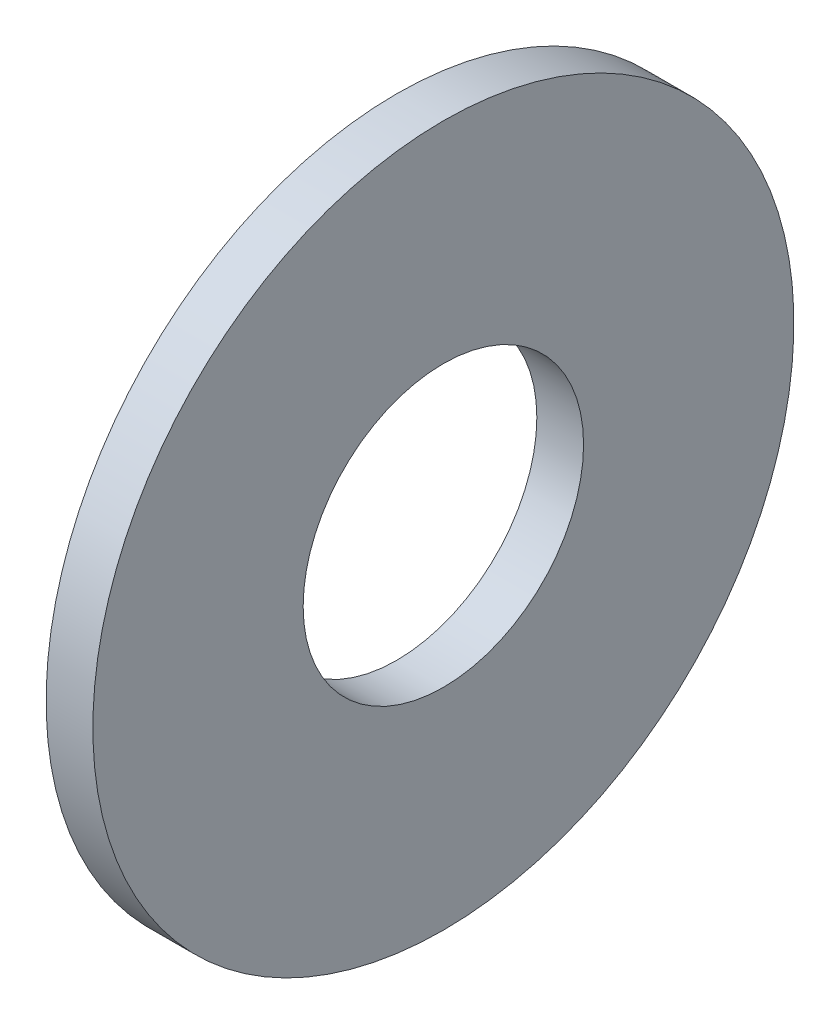
ISO-10303-21;
HEADER;
FILE_DESCRIPTION(('STEP AP214'),'2;1');
FILE_NAME('part.step','',(''),(''),'','','');
FILE_SCHEMA(('AUTOMOTIVE_DESIGN { 1 0 10303 214 1 1 1 1 }'));
ENDSEC;
DATA;
#1=APPLICATION_CONTEXT('core data for automotive mechanical design processes');
#2=APPLICATION_PROTOCOL_DEFINITION('international standard','automotive_design',2000,#1);
#3=PRODUCT_CONTEXT('',#1,'mechanical');
#4=PRODUCT('Part','Part','',(#3));
#5=PRODUCT_RELATED_PRODUCT_CATEGORY('part','',(#4));
#6=PRODUCT_DEFINITION_FORMATION('','',#4);
#7=PRODUCT_DEFINITION_CONTEXT('part definition',#1,'design');
#8=PRODUCT_DEFINITION('design','',#6,#7);
#9=PRODUCT_DEFINITION_SHAPE('','',#8);
#10=(LENGTH_UNIT() NAMED_UNIT(*) SI_UNIT(.MILLI.,.METRE.));
#11=(NAMED_UNIT(*) PLANE_ANGLE_UNIT() SI_UNIT($,.RADIAN.));
#12=(NAMED_UNIT(*) SI_UNIT($,.STERADIAN.) SOLID_ANGLE_UNIT());
#13=UNCERTAINTY_MEASURE_WITH_UNIT(LENGTH_MEASURE(1.E-05),#10,'distance_accuracy_value','');
#14=(GEOMETRIC_REPRESENTATION_CONTEXT(3) GLOBAL_UNCERTAINTY_ASSIGNED_CONTEXT((#13)) GLOBAL_UNIT_ASSIGNED_CONTEXT((#10,
#11,#12)) REPRESENTATION_CONTEXT('',''));
#15=CARTESIAN_POINT('',(0.,0.,0.));
#16=DIRECTION('',(0.,0.,1.));
#17=DIRECTION('',(1.,0.,0.));
#18=AXIS2_PLACEMENT_3D('',#15,#16,#17);
#19=CARTESIAN_POINT('',(0.3,0.,0.));
#20=DIRECTION('',(1.,0.,0.));
#21=DIRECTION('',(0.,1.,0.));
#22=AXIS2_PLACEMENT_3D('',#19,#20,#21);
#23=CYLINDRICAL_SURFACE('',#22,2.25);
#24=CARTESIAN_POINT('',(0.3,0.,0.));
#25=DIRECTION('',(1.,0.,0.));
#26=DIRECTION('',(0.,1.,0.));
#27=AXIS2_PLACEMENT_3D('',#24,#25,#26);
#28=CIRCLE('',#27,2.25);
#29=CARTESIAN_POINT('',(0.3,2.25,0.));
#30=VERTEX_POINT('',#29);
#31=EDGE_CURVE('E11',#30,#30,#28,.T.);
#32=ORIENTED_EDGE('',*,*,#31,.F.);
#33=EDGE_LOOP('',(#32));
#34=FACE_BOUND('',#33,.T.);
#35=CARTESIAN_POINT('',(0.,0.,0.));
#36=DIRECTION('',(1.,0.,0.));
#37=DIRECTION('',(0.,1.,0.));
#38=AXIS2_PLACEMENT_3D('',#35,#36,#37);
#39=CIRCLE('',#38,2.25);
#40=CARTESIAN_POINT('',(0.,2.25,0.));
#41=VERTEX_POINT('',#40);
#42=EDGE_CURVE('E49',#41,#41,#39,.T.);
#43=ORIENTED_EDGE('',*,*,#42,.T.);
#44=EDGE_LOOP('',(#43));
#45=FACE_BOUND('',#44,.T.);
#46=ADVANCED_FACE('F16',(#34,#45),#23,.T.);
#47=CARTESIAN_POINT('',(0.3,0.9,0.));
#48=DIRECTION('',(1.,0.,0.));
#49=DIRECTION('',(0.,-1.,0.));
#50=AXIS2_PLACEMENT_3D('',#47,#48,#49);
#51=PLANE('',#50);
#52=CARTESIAN_POINT('',(0.3,0.,0.));
#53=DIRECTION('',(1.,0.,0.));
#54=DIRECTION('',(0.,1.,0.));
#55=AXIS2_PLACEMENT_3D('',#52,#53,#54);
#56=CIRCLE('',#55,0.9);
#57=CARTESIAN_POINT('',(0.3,0.9,0.));
#58=VERTEX_POINT('',#57);
#59=EDGE_CURVE('E25',#58,#58,#56,.T.);
#60=ORIENTED_EDGE('',*,*,#59,.F.);
#61=EDGE_LOOP('',(#60));
#62=FACE_BOUND('',#61,.T.);
#63=ORIENTED_EDGE('',*,*,#31,.T.);
#64=EDGE_LOOP('',(#63));
#65=FACE_BOUND('',#64,.T.);
#66=ADVANCED_FACE('F64',(#62,#65),#51,.T.);
#67=CARTESIAN_POINT('',(0.3,0.,0.));
#68=DIRECTION('',(1.,0.,0.));
#69=DIRECTION('',(0.,1.,0.));
#70=AXIS2_PLACEMENT_3D('',#67,#68,#69);
#71=CYLINDRICAL_SURFACE('',#70,0.9);
#72=CARTESIAN_POINT('',(0.,0.,0.));
#73=DIRECTION('',(1.,0.,0.));
#74=DIRECTION('',(0.,1.,0.));
#75=AXIS2_PLACEMENT_3D('',#72,#73,#74);
#76=CIRCLE('',#75,0.9);
#77=CARTESIAN_POINT('',(0.,0.9,0.));
#78=VERTEX_POINT('',#77);
#79=EDGE_CURVE('E45',#78,#78,#76,.T.);
#80=ORIENTED_EDGE('',*,*,#79,.F.);
#81=EDGE_LOOP('',(#80));
#82=FACE_BOUND('',#81,.T.);
#83=ORIENTED_EDGE('',*,*,#59,.T.);
#84=EDGE_LOOP('',(#83));
#85=FACE_BOUND('',#84,.T.);
#86=ADVANCED_FACE('F62',(#82,#85),#71,.F.);
#87=CARTESIAN_POINT('',(0.,2.25,0.));
#88=DIRECTION('',(-1.,0.,0.));
#89=DIRECTION('',(0.,0.,1.));
#90=AXIS2_PLACEMENT_3D('',#87,#88,#89);
#91=PLANE('',#90);
#92=ORIENTED_EDGE('',*,*,#42,.F.);
#93=EDGE_LOOP('',(#92));
#94=FACE_BOUND('',#93,.T.);
#95=ORIENTED_EDGE('',*,*,#79,.T.);
#96=EDGE_LOOP('',(#95));
#97=FACE_BOUND('',#96,.T.);
#98=ADVANCED_FACE('F46',(#94,#97),#91,.T.);
#99=CLOSED_SHELL('',(#46,#66,#86,#98));
#100=MANIFOLD_SOLID_BREP('B1',#99);
#101=ADVANCED_BREP_SHAPE_REPRESENTATION('',(#18,#100),#14);
#102=SHAPE_DEFINITION_REPRESENTATION(#9,#101);
ENDSEC;
END-ISO-10303-21;
